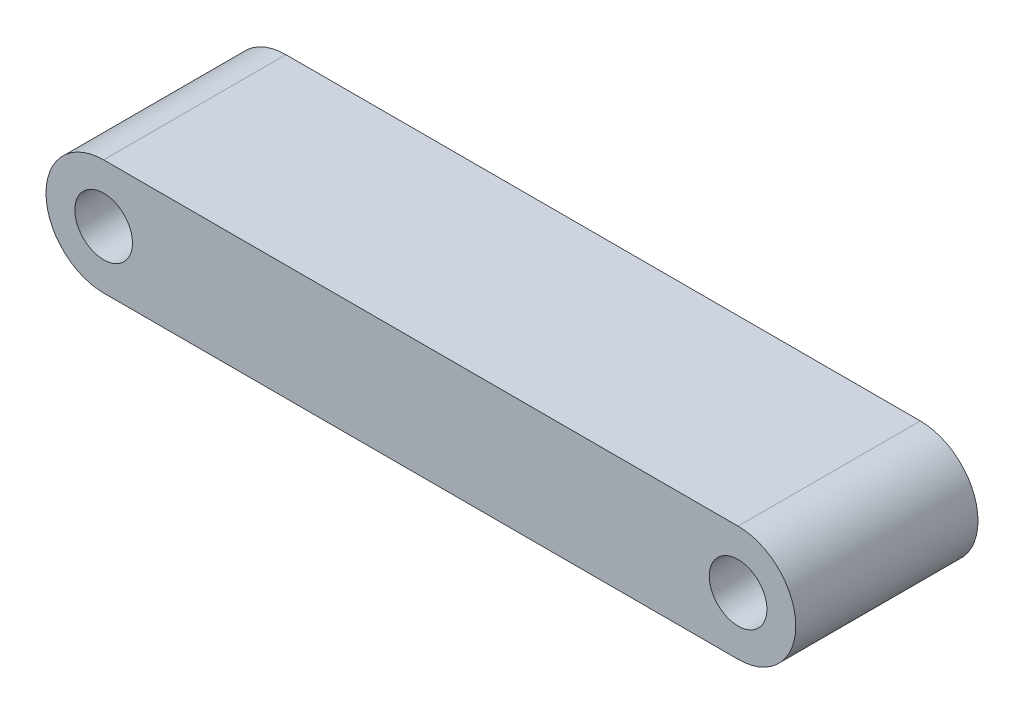
ISO-10303-21;
HEADER;
FILE_DESCRIPTION(('STEP AP214'),'2;1');
FILE_NAME('part.step','',(''),(''),'','','');
FILE_SCHEMA(('AUTOMOTIVE_DESIGN { 1 0 10303 214 1 1 1 1 }'));
ENDSEC;
DATA;
#1=APPLICATION_CONTEXT('core data for automotive mechanical design processes');
#2=APPLICATION_PROTOCOL_DEFINITION('international standard','automotive_design',2000,#1);
#3=PRODUCT_CONTEXT('',#1,'mechanical');
#4=PRODUCT('Part','Part','',(#3));
#5=PRODUCT_RELATED_PRODUCT_CATEGORY('part','',(#4));
#6=PRODUCT_DEFINITION_FORMATION('','',#4);
#7=PRODUCT_DEFINITION_CONTEXT('part definition',#1,'design');
#8=PRODUCT_DEFINITION('design','',#6,#7);
#9=PRODUCT_DEFINITION_SHAPE('','',#8);
#10=(LENGTH_UNIT() NAMED_UNIT(*) SI_UNIT(.MILLI.,.METRE.));
#11=(NAMED_UNIT(*) PLANE_ANGLE_UNIT() SI_UNIT($,.RADIAN.));
#12=(NAMED_UNIT(*) SI_UNIT($,.STERADIAN.) SOLID_ANGLE_UNIT());
#13=UNCERTAINTY_MEASURE_WITH_UNIT(LENGTH_MEASURE(1.E-05),#10,'distance_accuracy_value','');
#14=(GEOMETRIC_REPRESENTATION_CONTEXT(3) GLOBAL_UNCERTAINTY_ASSIGNED_CONTEXT((#13)) GLOBAL_UNIT_ASSIGNED_CONTEXT((#10,
#11,#12)) REPRESENTATION_CONTEXT('',''));
#15=CARTESIAN_POINT('',(0.,0.,0.));
#16=DIRECTION('',(0.,0.,1.));
#17=DIRECTION('',(1.,0.,0.));
#18=AXIS2_PLACEMENT_3D('',#15,#16,#17);
#19=CARTESIAN_POINT('',(0.,-5.05047301511867,0.));
#20=DIRECTION('',(0.,0.,1.));
#21=DIRECTION('',(1.,0.,0.));
#22=AXIS2_PLACEMENT_3D('',#19,#20,#21);
#23=PLANE('',#22);
#24=CARTESIAN_POINT('',(0.,-5.05047301511867,0.));
#25=DIRECTION('',(0.,0.,-1.));
#26=DIRECTION('',(-1.,0.,0.));
#27=AXIS2_PLACEMENT_3D('',#24,#25,#26);
#28=CIRCLE('',#27,2.5);
#29=CARTESIAN_POINT('',(-2.5,-5.05047301511867,0.));
#30=VERTEX_POINT('',#29);
#31=EDGE_CURVE('E91',#30,#30,#28,.T.);
#32=ORIENTED_EDGE('',*,*,#31,.F.);
#33=EDGE_LOOP('',(#32));
#34=FACE_BOUND('',#33,.T.);
#35=CARTESIAN_POINT('',(0.,-5.05047301511867,0.));
#36=DIRECTION('',(0.,0.,1.));
#37=DIRECTION('',(1.,0.,0.));
#38=AXIS2_PLACEMENT_3D('',#35,#36,#37);
#39=CIRCLE('',#38,5.);
#40=CARTESIAN_POINT('',(0.,-0.0504730151186759,0.));
#41=VERTEX_POINT('',#40);
#42=CARTESIAN_POINT('',(0.,-10.0504730151187,0.));
#43=VERTEX_POINT('',#42);
#44=EDGE_CURVE('E78',#41,#43,#39,.T.);
#45=ORIENTED_EDGE('',*,*,#44,.F.);
#46=DIRECTION('',(1.,0.,0.));
#47=VECTOR('',#46,1.);
#48=CARTESIAN_POINT('',(0.,-0.0504730151186759,0.));
#49=LINE('',#48,#47);
#50=CARTESIAN_POINT('',(55.,-0.0504730151186759,0.));
#51=VERTEX_POINT('',#50);
#52=EDGE_CURVE('E96',#41,#51,#49,.T.);
#53=ORIENTED_EDGE('',*,*,#52,.T.);
#54=CARTESIAN_POINT('',(55.,-5.05047301511867,0.));
#55=DIRECTION('',(0.,0.,-1.));
#56=DIRECTION('',(-1.,0.,0.));
#57=AXIS2_PLACEMENT_3D('',#54,#55,#56);
#58=CIRCLE('',#57,5.);
#59=CARTESIAN_POINT('',(55.,-10.0504730151187,0.));
#60=VERTEX_POINT('',#59);
#61=EDGE_CURVE('E79',#51,#60,#58,.T.);
#62=ORIENTED_EDGE('',*,*,#61,.T.);
#63=DIRECTION('',(1.,0.,0.));
#64=VECTOR('',#63,1.);
#65=CARTESIAN_POINT('',(0.,-10.0504730151187,0.));
#66=LINE('',#65,#64);
#67=EDGE_CURVE('E74',#43,#60,#66,.T.);
#68=ORIENTED_EDGE('',*,*,#67,.F.);
#69=EDGE_LOOP('',(#45,#53,#62,#68));
#70=FACE_BOUND('',#69,.T.);
#71=CARTESIAN_POINT('',(55.,-5.05047301511867,0.));
#72=DIRECTION('',(0.,0.,-1.));
#73=DIRECTION('',(-1.,0.,0.));
#74=AXIS2_PLACEMENT_3D('',#71,#72,#73);
#75=CIRCLE('',#74,2.5);
#76=CARTESIAN_POINT('',(52.5,-5.05047301511867,0.));
#77=VERTEX_POINT('',#76);
#78=EDGE_CURVE('E140',#77,#77,#75,.T.);
#79=ORIENTED_EDGE('',*,*,#78,.F.);
#80=EDGE_LOOP('',(#79));
#81=FACE_BOUND('',#80,.T.);
#82=ADVANCED_FACE('F30',(#34,#70,#81),#23,.F.);
#83=CARTESIAN_POINT('',(0.,-5.05047301511867,15.8));
#84=DIRECTION('',(0.,0.,1.));
#85=DIRECTION('',(1.,0.,0.));
#86=AXIS2_PLACEMENT_3D('',#83,#84,#85);
#87=PLANE('',#86);
#88=CARTESIAN_POINT('',(0.,-5.05047301511867,15.8));
#89=DIRECTION('',(0.,0.,-1.));
#90=DIRECTION('',(-1.,0.,0.));
#91=AXIS2_PLACEMENT_3D('',#88,#89,#90);
#92=CIRCLE('',#91,2.5);
#93=CARTESIAN_POINT('',(-2.5,-5.05047301511867,15.8));
#94=VERTEX_POINT('',#93);
#95=EDGE_CURVE('E88',#94,#94,#92,.T.);
#96=ORIENTED_EDGE('',*,*,#95,.T.);
#97=EDGE_LOOP('',(#96));
#98=FACE_BOUND('',#97,.T.);
#99=CARTESIAN_POINT('',(0.,-5.05047301511867,15.8));
#100=DIRECTION('',(0.,0.,1.));
#101=DIRECTION('',(1.,0.,0.));
#102=AXIS2_PLACEMENT_3D('',#99,#100,#101);
#103=CIRCLE('',#102,5.);
#104=CARTESIAN_POINT('',(0.,-0.0504730151186759,15.8));
#105=VERTEX_POINT('',#104);
#106=CARTESIAN_POINT('',(0.,-10.0504730151187,15.8));
#107=VERTEX_POINT('',#106);
#108=EDGE_CURVE('E98',#105,#107,#103,.T.);
#109=ORIENTED_EDGE('',*,*,#108,.T.);
#110=DIRECTION('',(1.,0.,0.));
#111=VECTOR('',#110,1.);
#112=CARTESIAN_POINT('',(0.,-10.0504730151187,15.8));
#113=LINE('',#112,#111);
#114=CARTESIAN_POINT('',(55.,-10.0504730151187,15.8));
#115=VERTEX_POINT('',#114);
#116=EDGE_CURVE('E85',#107,#115,#113,.T.);
#117=ORIENTED_EDGE('',*,*,#116,.T.);
#118=CARTESIAN_POINT('',(55.,-5.05047301511867,15.8));
#119=DIRECTION('',(0.,0.,-1.));
#120=DIRECTION('',(-1.,0.,0.));
#121=AXIS2_PLACEMENT_3D('',#118,#119,#120);
#122=CIRCLE('',#121,5.);
#123=CARTESIAN_POINT('',(55.,-0.0504730151186759,15.8));
#124=VERTEX_POINT('',#123);
#125=EDGE_CURVE('E101',#124,#115,#122,.T.);
#126=ORIENTED_EDGE('',*,*,#125,.F.);
#127=DIRECTION('',(1.,0.,0.));
#128=VECTOR('',#127,1.);
#129=CARTESIAN_POINT('',(0.,-0.0504730151186759,15.8));
#130=LINE('',#129,#128);
#131=EDGE_CURVE('E103',#105,#124,#130,.T.);
#132=ORIENTED_EDGE('',*,*,#131,.F.);
#133=EDGE_LOOP('',(#109,#117,#126,#132));
#134=FACE_BOUND('',#133,.T.);
#135=CARTESIAN_POINT('',(55.,-5.05047301511867,15.8));
#136=DIRECTION('',(0.,0.,-1.));
#137=DIRECTION('',(-1.,0.,0.));
#138=AXIS2_PLACEMENT_3D('',#135,#136,#137);
#139=CIRCLE('',#138,2.5);
#140=CARTESIAN_POINT('',(52.5,-5.05047301511867,15.8));
#141=VERTEX_POINT('',#140);
#142=EDGE_CURVE('E143',#141,#141,#139,.T.);
#143=ORIENTED_EDGE('',*,*,#142,.T.);
#144=EDGE_LOOP('',(#143));
#145=FACE_BOUND('',#144,.T.);
#146=ADVANCED_FACE('F109',(#98,#134,#145),#87,.T.);
#147=CARTESIAN_POINT('',(0.,-5.05047301511867,15.8));
#148=DIRECTION('',(0.,0.,-1.));
#149=DIRECTION('',(-1.,0.,0.));
#150=AXIS2_PLACEMENT_3D('',#147,#148,#149);
#151=CYLINDRICAL_SURFACE('',#150,5.);
#152=ORIENTED_EDGE('',*,*,#44,.T.);
#153=DIRECTION('',(0.,0.,-1.));
#154=VECTOR('',#153,1.);
#155=CARTESIAN_POINT('',(0.,-10.0504730151187,15.8));
#156=LINE('',#155,#154);
#157=EDGE_CURVE('E11',#107,#43,#156,.T.);
#158=ORIENTED_EDGE('',*,*,#157,.F.);
#159=ORIENTED_EDGE('',*,*,#108,.F.);
#160=DIRECTION('',(0.,0.,-1.));
#161=VECTOR('',#160,1.);
#162=CARTESIAN_POINT('',(0.,-0.0504730151186759,15.8));
#163=LINE('',#162,#161);
#164=EDGE_CURVE('E45',#105,#41,#163,.T.);
#165=ORIENTED_EDGE('',*,*,#164,.T.);
#166=EDGE_LOOP('',(#152,#158,#159,#165));
#167=FACE_BOUND('',#166,.T.);
#168=ADVANCED_FACE('F32',(#167),#151,.T.);
#169=CARTESIAN_POINT('',(0.,-10.0504730151187,15.8));
#170=DIRECTION('',(0.,1.,0.));
#171=DIRECTION('',(0.,0.,1.));
#172=AXIS2_PLACEMENT_3D('',#169,#170,#171);
#173=PLANE('',#172);
#174=ORIENTED_EDGE('',*,*,#67,.T.);
#175=DIRECTION('',(0.,0.,-1.));
#176=VECTOR('',#175,1.);
#177=CARTESIAN_POINT('',(55.,-10.0504730151187,15.8));
#178=LINE('',#177,#176);
#179=EDGE_CURVE('E38',#115,#60,#178,.T.);
#180=ORIENTED_EDGE('',*,*,#179,.F.);
#181=ORIENTED_EDGE('',*,*,#116,.F.);
#182=ORIENTED_EDGE('',*,*,#157,.T.);
#183=EDGE_LOOP('',(#174,#180,#181,#182));
#184=FACE_BOUND('',#183,.T.);
#185=ADVANCED_FACE('F84',(#184),#173,.F.);
#186=CARTESIAN_POINT('',(55.,-5.05047301511867,15.8));
#187=DIRECTION('',(0.,0.,-1.));
#188=DIRECTION('',(-1.,0.,0.));
#189=AXIS2_PLACEMENT_3D('',#186,#187,#188);
#190=CYLINDRICAL_SURFACE('',#189,5.);
#191=ORIENTED_EDGE('',*,*,#61,.F.);
#192=DIRECTION('',(0.,0.,-1.));
#193=VECTOR('',#192,1.);
#194=CARTESIAN_POINT('',(55.,-0.0504730151186759,15.8));
#195=LINE('',#194,#193);
#196=EDGE_CURVE('E53',#124,#51,#195,.T.);
#197=ORIENTED_EDGE('',*,*,#196,.F.);
#198=ORIENTED_EDGE('',*,*,#125,.T.);
#199=ORIENTED_EDGE('',*,*,#179,.T.);
#200=EDGE_LOOP('',(#191,#197,#198,#199));
#201=FACE_BOUND('',#200,.T.);
#202=ADVANCED_FACE('F106',(#201),#190,.T.);
#203=CARTESIAN_POINT('',(0.,-0.0504730151186759,15.8));
#204=DIRECTION('',(0.,1.,0.));
#205=DIRECTION('',(0.,0.,1.));
#206=AXIS2_PLACEMENT_3D('',#203,#204,#205);
#207=PLANE('',#206);
#208=ORIENTED_EDGE('',*,*,#52,.F.);
#209=ORIENTED_EDGE('',*,*,#164,.F.);
#210=ORIENTED_EDGE('',*,*,#131,.T.);
#211=ORIENTED_EDGE('',*,*,#196,.T.);
#212=EDGE_LOOP('',(#208,#209,#210,#211));
#213=FACE_BOUND('',#212,.T.);
#214=ADVANCED_FACE('F111',(#213),#207,.T.);
#215=CARTESIAN_POINT('',(0.,-5.05047301511867,0.));
#216=DIRECTION('',(0.,0.,-1.));
#217=DIRECTION('',(-1.,0.,0.));
#218=AXIS2_PLACEMENT_3D('',#215,#216,#217);
#219=CYLINDRICAL_SURFACE('',#218,2.5);
#220=ORIENTED_EDGE('',*,*,#31,.T.);
#221=EDGE_LOOP('',(#220));
#222=FACE_BOUND('',#221,.T.);
#223=ORIENTED_EDGE('',*,*,#95,.F.);
#224=EDGE_LOOP('',(#223));
#225=FACE_BOUND('',#224,.T.);
#226=ADVANCED_FACE('F113',(#222,#225),#219,.F.);
#227=CARTESIAN_POINT('',(55.,-5.05047301511867,0.));
#228=DIRECTION('',(0.,0.,-1.));
#229=DIRECTION('',(-1.,0.,0.));
#230=AXIS2_PLACEMENT_3D('',#227,#228,#229);
#231=CYLINDRICAL_SURFACE('',#230,2.5);
#232=ORIENTED_EDGE('',*,*,#78,.T.);
#233=EDGE_LOOP('',(#232));
#234=FACE_BOUND('',#233,.T.);
#235=ORIENTED_EDGE('',*,*,#142,.F.);
#236=EDGE_LOOP('',(#235));
#237=FACE_BOUND('',#236,.T.);
#238=ADVANCED_FACE('F119',(#234,#237),#231,.F.);
#239=CLOSED_SHELL('',(#82,#146,#168,#185,#202,#214,#226,#238));
#240=MANIFOLD_SOLID_BREP('B2',#239);
#241=ADVANCED_BREP_SHAPE_REPRESENTATION('',(#18,#240),#14);
#242=SHAPE_DEFINITION_REPRESENTATION(#9,#241);
ENDSEC;
END-ISO-10303-21;
